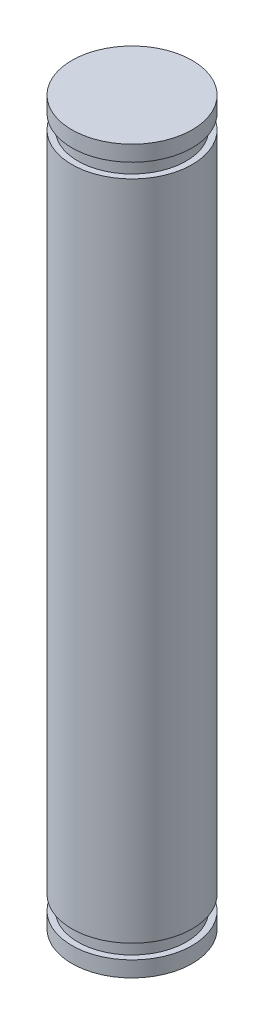
ISO-10303-21;
HEADER;
FILE_DESCRIPTION(('STEP AP214'),'2;1');
FILE_NAME('part.step','',(''),(''),'','','');
FILE_SCHEMA(('AUTOMOTIVE_DESIGN { 1 0 10303 214 1 1 1 1 }'));
ENDSEC;
DATA;
#1=APPLICATION_CONTEXT('core data for automotive mechanical design processes');
#2=APPLICATION_PROTOCOL_DEFINITION('international standard','automotive_design',2000,#1);
#3=PRODUCT_CONTEXT('',#1,'mechanical');
#4=PRODUCT('Part','Part','',(#3));
#5=PRODUCT_RELATED_PRODUCT_CATEGORY('part','',(#4));
#6=PRODUCT_DEFINITION_FORMATION('','',#4);
#7=PRODUCT_DEFINITION_CONTEXT('part definition',#1,'design');
#8=PRODUCT_DEFINITION('design','',#6,#7);
#9=PRODUCT_DEFINITION_SHAPE('','',#8);
#10=(LENGTH_UNIT() NAMED_UNIT(*) SI_UNIT(.MILLI.,.METRE.));
#11=(NAMED_UNIT(*) PLANE_ANGLE_UNIT() SI_UNIT($,.RADIAN.));
#12=(NAMED_UNIT(*) SI_UNIT($,.STERADIAN.) SOLID_ANGLE_UNIT());
#13=UNCERTAINTY_MEASURE_WITH_UNIT(LENGTH_MEASURE(1.E-05),#10,'distance_accuracy_value','');
#14=(GEOMETRIC_REPRESENTATION_CONTEXT(3) GLOBAL_UNCERTAINTY_ASSIGNED_CONTEXT((#13)) GLOBAL_UNIT_ASSIGNED_CONTEXT((#10,
#11,#12)) REPRESENTATION_CONTEXT('',''));
#15=CARTESIAN_POINT('',(0.,0.,0.));
#16=DIRECTION('',(0.,0.,1.));
#17=DIRECTION('',(1.,0.,0.));
#18=AXIS2_PLACEMENT_3D('',#15,#16,#17);
#19=CARTESIAN_POINT('',(-11.955644483101,16.1149363933196,0.));
#20=DIRECTION('',(0.,-1.,0.));
#21=DIRECTION('',(0.,0.,-1.));
#22=AXIS2_PLACEMENT_3D('',#19,#20,#21);
#23=CYLINDRICAL_SURFACE('',#22,5.);
#24=CARTESIAN_POINT('',(-11.955644483101,17.4149363933196,0.));
#25=DIRECTION('',(0.,-1.,0.));
#26=DIRECTION('',(0.,0.,-1.));
#27=AXIS2_PLACEMENT_3D('',#24,#25,#26);
#28=CIRCLE('',#27,5.);
#29=CARTESIAN_POINT('',(-11.955644483101,17.4149363933196,-5.));
#30=VERTEX_POINT('',#29);
#31=EDGE_CURVE('E10',#30,#30,#28,.T.);
#32=ORIENTED_EDGE('',*,*,#31,.T.);
#33=EDGE_LOOP('',(#32));
#34=FACE_BOUND('',#33,.T.);
#35=CARTESIAN_POINT('',(-11.955644483101,16.1149363933196,0.));
#36=DIRECTION('',(0.,-1.,0.));
#37=DIRECTION('',(0.,0.,-1.));
#38=AXIS2_PLACEMENT_3D('',#35,#36,#37);
#39=CIRCLE('',#38,5.);
#40=CARTESIAN_POINT('',(-11.955644483101,16.1149363933196,-5.));
#41=VERTEX_POINT('',#40);
#42=EDGE_CURVE('E80',#41,#41,#39,.T.);
#43=ORIENTED_EDGE('',*,*,#42,.F.);
#44=EDGE_LOOP('',(#43));
#45=FACE_BOUND('',#44,.T.);
#46=ADVANCED_FACE('F37',(#34,#45),#23,.T.);
#47=CARTESIAN_POINT('',(-6.95564448310102,17.4149363933196,0.));
#48=DIRECTION('',(0.,1.,0.));
#49=DIRECTION('',(0.,0.,1.));
#50=AXIS2_PLACEMENT_3D('',#47,#48,#49);
#51=PLANE('',#50);
#52=CARTESIAN_POINT('',(-11.955644483101,17.4149363933196,0.));
#53=DIRECTION('',(0.,-1.,0.));
#54=DIRECTION('',(0.,0.,-1.));
#55=AXIS2_PLACEMENT_3D('',#52,#53,#54);
#56=CIRCLE('',#55,4.5);
#57=CARTESIAN_POINT('',(-11.955644483101,17.4149363933196,-4.5));
#58=VERTEX_POINT('',#57);
#59=EDGE_CURVE('E44',#58,#58,#56,.T.);
#60=ORIENTED_EDGE('',*,*,#59,.T.);
#61=EDGE_LOOP('',(#60));
#62=FACE_BOUND('',#61,.T.);
#63=ORIENTED_EDGE('',*,*,#31,.F.);
#64=EDGE_LOOP('',(#63));
#65=FACE_BOUND('',#64,.T.);
#66=ADVANCED_FACE('F88',(#62,#65),#51,.T.);
#67=CARTESIAN_POINT('',(-11.955644483101,16.1149363933196,0.));
#68=DIRECTION('',(0.,-1.,0.));
#69=DIRECTION('',(0.,0.,-1.));
#70=AXIS2_PLACEMENT_3D('',#67,#68,#69);
#71=CYLINDRICAL_SURFACE('',#70,4.5);
#72=CARTESIAN_POINT('',(-11.955644483101,18.6149363933196,0.));
#73=DIRECTION('',(0.,-1.,0.));
#74=DIRECTION('',(0.,0.,-1.));
#75=AXIS2_PLACEMENT_3D('',#72,#73,#74);
#76=CIRCLE('',#75,4.5);
#77=CARTESIAN_POINT('',(-11.955644483101,18.6149363933196,-4.5));
#78=VERTEX_POINT('',#77);
#79=EDGE_CURVE('E49',#78,#78,#76,.T.);
#80=ORIENTED_EDGE('',*,*,#79,.T.);
#81=EDGE_LOOP('',(#80));
#82=FACE_BOUND('',#81,.T.);
#83=ORIENTED_EDGE('',*,*,#59,.F.);
#84=EDGE_LOOP('',(#83));
#85=FACE_BOUND('',#84,.T.);
#86=ADVANCED_FACE('F92',(#82,#85),#71,.T.);
#87=CARTESIAN_POINT('',(-7.45564448310102,18.6149363933196,0.));
#88=DIRECTION('',(0.,-1.,0.));
#89=DIRECTION('',(0.,0.,-1.));
#90=AXIS2_PLACEMENT_3D('',#87,#88,#89);
#91=PLANE('',#90);
#92=CARTESIAN_POINT('',(-11.955644483101,18.6149363933196,0.));
#93=DIRECTION('',(0.,-1.,0.));
#94=DIRECTION('',(0.,0.,-1.));
#95=AXIS2_PLACEMENT_3D('',#92,#93,#94);
#96=CIRCLE('',#95,5.);
#97=CARTESIAN_POINT('',(-11.955644483101,18.6149363933196,-5.));
#98=VERTEX_POINT('',#97);
#99=EDGE_CURVE('E54',#98,#98,#96,.T.);
#100=ORIENTED_EDGE('',*,*,#99,.T.);
#101=EDGE_LOOP('',(#100));
#102=FACE_BOUND('',#101,.T.);
#103=ORIENTED_EDGE('',*,*,#79,.F.);
#104=EDGE_LOOP('',(#103));
#105=FACE_BOUND('',#104,.T.);
#106=ADVANCED_FACE('F96',(#102,#105),#91,.T.);
#107=CARTESIAN_POINT('',(-11.955644483101,16.1149363933196,0.));
#108=DIRECTION('',(0.,-1.,0.));
#109=DIRECTION('',(0.,0.,-1.));
#110=AXIS2_PLACEMENT_3D('',#107,#108,#109);
#111=CYLINDRICAL_SURFACE('',#110,5.);
#112=CARTESIAN_POINT('',(-11.955644483101,73.6149363933196,0.));
#113=DIRECTION('',(0.,-1.,0.));
#114=DIRECTION('',(0.,0.,-1.));
#115=AXIS2_PLACEMENT_3D('',#112,#113,#114);
#116=CIRCLE('',#115,5.);
#117=CARTESIAN_POINT('',(-11.955644483101,73.6149363933196,-5.));
#118=VERTEX_POINT('',#117);
#119=EDGE_CURVE('E60',#118,#118,#116,.T.);
#120=ORIENTED_EDGE('',*,*,#119,.T.);
#121=EDGE_LOOP('',(#120));
#122=FACE_BOUND('',#121,.T.);
#123=ORIENTED_EDGE('',*,*,#99,.F.);
#124=EDGE_LOOP('',(#123));
#125=FACE_BOUND('',#124,.T.);
#126=ADVANCED_FACE('F103',(#122,#125),#111,.T.);
#127=CARTESIAN_POINT('',(-6.95564448310102,73.6149363933196,0.));
#128=DIRECTION('',(0.,1.,0.));
#129=DIRECTION('',(0.,0.,1.));
#130=AXIS2_PLACEMENT_3D('',#127,#128,#129);
#131=PLANE('',#130);
#132=CARTESIAN_POINT('',(-11.955644483101,73.6149363933196,0.));
#133=DIRECTION('',(0.,-1.,0.));
#134=DIRECTION('',(0.,0.,-1.));
#135=AXIS2_PLACEMENT_3D('',#132,#133,#134);
#136=CIRCLE('',#135,4.5);
#137=CARTESIAN_POINT('',(-11.955644483101,73.6149363933196,-4.5));
#138=VERTEX_POINT('',#137);
#139=EDGE_CURVE('E64',#138,#138,#136,.T.);
#140=ORIENTED_EDGE('',*,*,#139,.T.);
#141=EDGE_LOOP('',(#140));
#142=FACE_BOUND('',#141,.T.);
#143=ORIENTED_EDGE('',*,*,#119,.F.);
#144=EDGE_LOOP('',(#143));
#145=FACE_BOUND('',#144,.T.);
#146=ADVANCED_FACE('F107',(#142,#145),#131,.T.);
#147=CARTESIAN_POINT('',(-11.955644483101,16.1149363933196,0.));
#148=DIRECTION('',(0.,-1.,0.));
#149=DIRECTION('',(0.,0.,-1.));
#150=AXIS2_PLACEMENT_3D('',#147,#148,#149);
#151=CYLINDRICAL_SURFACE('',#150,4.5);
#152=CARTESIAN_POINT('',(-11.955644483101,74.8149363933196,0.));
#153=DIRECTION('',(0.,-1.,0.));
#154=DIRECTION('',(0.,0.,-1.));
#155=AXIS2_PLACEMENT_3D('',#152,#153,#154);
#156=CIRCLE('',#155,4.5);
#157=CARTESIAN_POINT('',(-11.955644483101,74.8149363933196,-4.5));
#158=VERTEX_POINT('',#157);
#159=EDGE_CURVE('E68',#158,#158,#156,.T.);
#160=ORIENTED_EDGE('',*,*,#159,.T.);
#161=EDGE_LOOP('',(#160));
#162=FACE_BOUND('',#161,.T.);
#163=ORIENTED_EDGE('',*,*,#139,.F.);
#164=EDGE_LOOP('',(#163));
#165=FACE_BOUND('',#164,.T.);
#166=ADVANCED_FACE('F111',(#162,#165),#151,.T.);
#167=CARTESIAN_POINT('',(-7.45564448310102,74.8149363933196,0.));
#168=DIRECTION('',(0.,-1.,0.));
#169=DIRECTION('',(0.,0.,-1.));
#170=AXIS2_PLACEMENT_3D('',#167,#168,#169);
#171=PLANE('',#170);
#172=CARTESIAN_POINT('',(-11.955644483101,74.8149363933196,0.));
#173=DIRECTION('',(0.,-1.,0.));
#174=DIRECTION('',(0.,0.,-1.));
#175=AXIS2_PLACEMENT_3D('',#172,#173,#174);
#176=CIRCLE('',#175,5.);
#177=CARTESIAN_POINT('',(-11.955644483101,74.8149363933196,-5.));
#178=VERTEX_POINT('',#177);
#179=EDGE_CURVE('E72',#178,#178,#176,.T.);
#180=ORIENTED_EDGE('',*,*,#179,.T.);
#181=EDGE_LOOP('',(#180));
#182=FACE_BOUND('',#181,.T.);
#183=ORIENTED_EDGE('',*,*,#159,.F.);
#184=EDGE_LOOP('',(#183));
#185=FACE_BOUND('',#184,.T.);
#186=ADVANCED_FACE('F115',(#182,#185),#171,.T.);
#187=CARTESIAN_POINT('',(-11.955644483101,16.1149363933196,0.));
#188=DIRECTION('',(0.,-1.,0.));
#189=DIRECTION('',(0.,0.,-1.));
#190=AXIS2_PLACEMENT_3D('',#187,#188,#189);
#191=CYLINDRICAL_SURFACE('',#190,5.);
#192=CARTESIAN_POINT('',(-11.955644483101,76.1149363933196,0.));
#193=DIRECTION('',(0.,-1.,0.));
#194=DIRECTION('',(0.,0.,-1.));
#195=AXIS2_PLACEMENT_3D('',#192,#193,#194);
#196=CIRCLE('',#195,5.);
#197=CARTESIAN_POINT('',(-11.955644483101,76.1149363933196,-5.));
#198=VERTEX_POINT('',#197);
#199=EDGE_CURVE('E76',#198,#198,#196,.T.);
#200=ORIENTED_EDGE('',*,*,#199,.T.);
#201=EDGE_LOOP('',(#200));
#202=FACE_BOUND('',#201,.T.);
#203=ORIENTED_EDGE('',*,*,#179,.F.);
#204=EDGE_LOOP('',(#203));
#205=FACE_BOUND('',#204,.T.);
#206=ADVANCED_FACE('F119',(#202,#205),#191,.T.);
#207=CARTESIAN_POINT('',(-6.95564448310102,76.1149363933196,0.));
#208=DIRECTION('',(0.,1.,0.));
#209=DIRECTION('',(0.,0.,1.));
#210=AXIS2_PLACEMENT_3D('',#207,#208,#209);
#211=PLANE('',#210);
#212=ORIENTED_EDGE('',*,*,#199,.F.);
#213=EDGE_LOOP('',(#212));
#214=FACE_BOUND('',#213,.T.);
#215=ADVANCED_FACE('F123',(#214),#211,.T.);
#216=CARTESIAN_POINT('',(-6.95564448310102,16.1149363933196,0.));
#217=DIRECTION('',(0.,-1.,0.));
#218=DIRECTION('',(0.,0.,-1.));
#219=AXIS2_PLACEMENT_3D('',#216,#217,#218);
#220=PLANE('',#219);
#221=ORIENTED_EDGE('',*,*,#42,.T.);
#222=EDGE_LOOP('',(#221));
#223=FACE_BOUND('',#222,.T.);
#224=ADVANCED_FACE('F85',(#223),#220,.T.);
#225=CLOSED_SHELL('',(#46,#66,#86,#106,#126,#146,#166,#186,#206,#215,#224));
#226=MANIFOLD_SOLID_BREP('B2',#225);
#227=ADVANCED_BREP_SHAPE_REPRESENTATION('',(#18,#226),#14);
#228=SHAPE_DEFINITION_REPRESENTATION(#9,#227);
ENDSEC;
END-ISO-10303-21;
